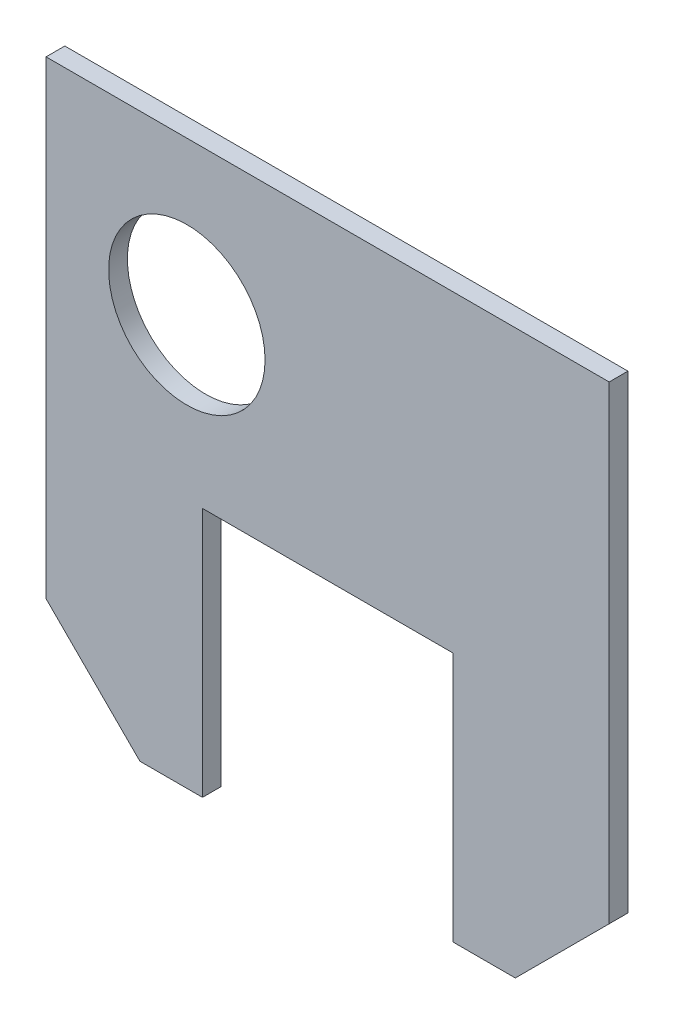
ISO-10303-21;
HEADER;
FILE_DESCRIPTION(('STEP AP214'),'2;1');
FILE_NAME('part.step','',(''),(''),'','','');
FILE_SCHEMA(('AUTOMOTIVE_DESIGN { 1 0 10303 214 1 1 1 1 }'));
ENDSEC;
DATA;
#1=APPLICATION_CONTEXT('core data for automotive mechanical design processes');
#2=APPLICATION_PROTOCOL_DEFINITION('international standard','automotive_design',2000,#1);
#3=PRODUCT_CONTEXT('',#1,'mechanical');
#4=PRODUCT('Part','Part','',(#3));
#5=PRODUCT_RELATED_PRODUCT_CATEGORY('part','',(#4));
#6=PRODUCT_DEFINITION_FORMATION('','',#4);
#7=PRODUCT_DEFINITION_CONTEXT('part definition',#1,'design');
#8=PRODUCT_DEFINITION('design','',#6,#7);
#9=PRODUCT_DEFINITION_SHAPE('','',#8);
#10=(LENGTH_UNIT() NAMED_UNIT(*) SI_UNIT(.MILLI.,.METRE.));
#11=(NAMED_UNIT(*) PLANE_ANGLE_UNIT() SI_UNIT($,.RADIAN.));
#12=(NAMED_UNIT(*) SI_UNIT($,.STERADIAN.) SOLID_ANGLE_UNIT());
#13=UNCERTAINTY_MEASURE_WITH_UNIT(LENGTH_MEASURE(1.E-05),#10,'distance_accuracy_value','');
#14=(GEOMETRIC_REPRESENTATION_CONTEXT(3) GLOBAL_UNCERTAINTY_ASSIGNED_CONTEXT((#13)) GLOBAL_UNIT_ASSIGNED_CONTEXT((#10,
#11,#12)) REPRESENTATION_CONTEXT('',''));
#15=CARTESIAN_POINT('',(0.,0.,0.));
#16=DIRECTION('',(0.,0.,1.));
#17=DIRECTION('',(1.,0.,0.));
#18=AXIS2_PLACEMENT_3D('',#15,#16,#17);
#19=CARTESIAN_POINT('',(-11.2795505617978,31.7797752808989,3.));
#20=DIRECTION('',(1.,0.,0.));
#21=DIRECTION('',(0.,1.,0.));
#22=AXIS2_PLACEMENT_3D('',#19,#20,#21);
#23=PLANE('',#22);
#24=DIRECTION('',(0.,-1.,0.));
#25=VECTOR('',#24,1.);
#26=CARTESIAN_POINT('',(-11.2795505617978,31.7797752808989,0.));
#27=LINE('',#26,#25);
#28=CARTESIAN_POINT('',(-11.2795505617978,31.7797752808989,0.));
#29=VERTEX_POINT('',#28);
#30=CARTESIAN_POINT('',(-11.2795505617978,-43.2202247191013,0.));
#31=VERTEX_POINT('',#30);
#32=EDGE_CURVE('E116',#29,#31,#27,.T.);
#33=ORIENTED_EDGE('',*,*,#32,.T.);
#34=DIRECTION('',(0.,0.,-1.));
#35=VECTOR('',#34,1.);
#36=CARTESIAN_POINT('',(-11.2795505617978,-43.2202247191013,3.));
#37=LINE('',#36,#35);
#38=CARTESIAN_POINT('',(-11.2795505617978,-43.2202247191013,3.));
#39=VERTEX_POINT('',#38);
#40=EDGE_CURVE('E11',#39,#31,#37,.T.);
#41=ORIENTED_EDGE('',*,*,#40,.F.);
#42=DIRECTION('',(0.,-1.,0.));
#43=VECTOR('',#42,1.);
#44=CARTESIAN_POINT('',(-11.2795505617978,31.7797752808989,3.));
#45=LINE('',#44,#43);
#46=CARTESIAN_POINT('',(-11.2795505617978,31.7797752808989,3.));
#47=VERTEX_POINT('',#46);
#48=EDGE_CURVE('E119',#47,#39,#45,.T.);
#49=ORIENTED_EDGE('',*,*,#48,.F.);
#50=DIRECTION('',(0.,0.,-1.));
#51=VECTOR('',#50,1.);
#52=CARTESIAN_POINT('',(-11.2795505617978,31.7797752808989,3.));
#53=LINE('',#52,#51);
#54=EDGE_CURVE('E181',#47,#29,#53,.T.);
#55=ORIENTED_EDGE('',*,*,#54,.T.);
#56=EDGE_LOOP('',(#33,#41,#49,#55));
#57=FACE_BOUND('',#56,.T.);
#58=ADVANCED_FACE('F32',(#57),#23,.F.);
#59=CARTESIAN_POINT('',(3.72044943820224,-58.2202247191011,3.));
#60=DIRECTION('',(0.707106781186543,0.707106781186552,0.));
#61=DIRECTION('',(-0.707106781186552,0.707106781186543,0.));
#62=AXIS2_PLACEMENT_3D('',#59,#60,#61);
#63=PLANE('',#62);
#64=DIRECTION('',(0.707106781186551,-0.707106781186543,0.));
#65=VECTOR('',#64,1.);
#66=CARTESIAN_POINT('',(3.72044943820224,-58.2202247191011,0.));
#67=LINE('',#66,#65);
#68=CARTESIAN_POINT('',(3.72044943820224,-58.2202247191011,0.));
#69=VERTEX_POINT('',#68);
#70=EDGE_CURVE('E165',#31,#69,#67,.T.);
#71=ORIENTED_EDGE('',*,*,#70,.T.);
#72=DIRECTION('',(0.,0.,-1.));
#73=VECTOR('',#72,1.);
#74=CARTESIAN_POINT('',(3.72044943820224,-58.2202247191011,3.));
#75=LINE('',#74,#73);
#76=CARTESIAN_POINT('',(3.72044943820224,-58.2202247191011,3.));
#77=VERTEX_POINT('',#76);
#78=EDGE_CURVE('E39',#77,#69,#75,.T.);
#79=ORIENTED_EDGE('',*,*,#78,.F.);
#80=DIRECTION('',(0.707106781186551,-0.707106781186543,0.));
#81=VECTOR('',#80,1.);
#82=CARTESIAN_POINT('',(3.72044943820224,-58.2202247191011,3.));
#83=LINE('',#82,#81);
#84=EDGE_CURVE('E173',#39,#77,#83,.T.);
#85=ORIENTED_EDGE('',*,*,#84,.F.);
#86=ORIENTED_EDGE('',*,*,#40,.T.);
#87=EDGE_LOOP('',(#71,#79,#85,#86));
#88=FACE_BOUND('',#87,.T.);
#89=ADVANCED_FACE('F225',(#88),#63,.F.);
#90=CARTESIAN_POINT('',(3.72044943820224,-58.2202247191011,3.));
#91=DIRECTION('',(0.,1.,0.));
#92=DIRECTION('',(0.,0.,1.));
#93=AXIS2_PLACEMENT_3D('',#90,#91,#92);
#94=PLANE('',#93);
#95=DIRECTION('',(1.,0.,0.));
#96=VECTOR('',#95,1.);
#97=CARTESIAN_POINT('',(3.72044943820224,-58.2202247191011,0.));
#98=LINE('',#97,#96);
#99=CARTESIAN_POINT('',(13.7204494382022,-58.2202247191011,0.));
#100=VERTEX_POINT('',#99);
#101=EDGE_CURVE('E167',#69,#100,#98,.T.);
#102=ORIENTED_EDGE('',*,*,#101,.T.);
#103=DIRECTION('',(0.,0.,-1.));
#104=VECTOR('',#103,1.);
#105=CARTESIAN_POINT('',(13.7204494382022,-58.2202247191011,3.));
#106=LINE('',#105,#104);
#107=CARTESIAN_POINT('',(13.7204494382022,-58.2202247191011,3.));
#108=VERTEX_POINT('',#107);
#109=EDGE_CURVE('E186',#108,#100,#106,.T.);
#110=ORIENTED_EDGE('',*,*,#109,.F.);
#111=DIRECTION('',(1.,0.,0.));
#112=VECTOR('',#111,1.);
#113=CARTESIAN_POINT('',(3.72044943820224,-58.2202247191011,3.));
#114=LINE('',#113,#112);
#115=EDGE_CURVE('E175',#77,#108,#114,.T.);
#116=ORIENTED_EDGE('',*,*,#115,.F.);
#117=ORIENTED_EDGE('',*,*,#78,.T.);
#118=EDGE_LOOP('',(#102,#110,#116,#117));
#119=FACE_BOUND('',#118,.T.);
#120=ADVANCED_FACE('F193',(#119),#94,.F.);
#121=CARTESIAN_POINT('',(13.7204494382022,-58.2202247191011,3.));
#122=DIRECTION('',(-1.,0.,0.));
#123=DIRECTION('',(0.,0.,1.));
#124=AXIS2_PLACEMENT_3D('',#121,#122,#123);
#125=PLANE('',#124);
#126=DIRECTION('',(0.,1.,0.));
#127=VECTOR('',#126,1.);
#128=CARTESIAN_POINT('',(13.7204494382022,-58.2202247191011,0.));
#129=LINE('',#128,#127);
#130=CARTESIAN_POINT('',(13.7204494382022,-18.2202247191011,0.));
#131=VERTEX_POINT('',#130);
#132=EDGE_CURVE('E169',#100,#131,#129,.T.);
#133=ORIENTED_EDGE('',*,*,#132,.T.);
#134=DIRECTION('',(0.,0.,-1.));
#135=VECTOR('',#134,1.);
#136=CARTESIAN_POINT('',(13.7204494382022,-18.2202247191011,3.));
#137=LINE('',#136,#135);
#138=CARTESIAN_POINT('',(13.7204494382022,-18.2202247191011,3.));
#139=VERTEX_POINT('',#138);
#140=EDGE_CURVE('E183',#139,#131,#137,.T.);
#141=ORIENTED_EDGE('',*,*,#140,.F.);
#142=DIRECTION('',(0.,1.,0.));
#143=VECTOR('',#142,1.);
#144=CARTESIAN_POINT('',(13.7204494382022,-58.2202247191011,3.));
#145=LINE('',#144,#143);
#146=EDGE_CURVE('E53',#108,#139,#145,.T.);
#147=ORIENTED_EDGE('',*,*,#146,.F.);
#148=ORIENTED_EDGE('',*,*,#109,.T.);
#149=EDGE_LOOP('',(#133,#141,#147,#148));
#150=FACE_BOUND('',#149,.T.);
#151=ADVANCED_FACE('F199',(#150),#125,.F.);
#152=CARTESIAN_POINT('',(13.7204494382022,-18.2202247191011,3.));
#153=DIRECTION('',(0.,1.,0.));
#154=DIRECTION('',(-1.,0.,0.));
#155=AXIS2_PLACEMENT_3D('',#152,#153,#154);
#156=PLANE('',#155);
#157=DIRECTION('',(1.,0.,0.));
#158=VECTOR('',#157,1.);
#159=CARTESIAN_POINT('',(13.7204494382022,-18.2202247191011,0.));
#160=LINE('',#159,#158);
#161=CARTESIAN_POINT('',(53.7204494382022,-18.2202247191011,0.));
#162=VERTEX_POINT('',#161);
#163=EDGE_CURVE('E120',#131,#162,#160,.T.);
#164=ORIENTED_EDGE('',*,*,#163,.T.);
#165=DIRECTION('',(0.,0.,-1.));
#166=VECTOR('',#165,1.);
#167=CARTESIAN_POINT('',(53.7204494382022,-18.2202247191011,3.));
#168=LINE('',#167,#166);
#169=CARTESIAN_POINT('',(53.7204494382022,-18.2202247191011,3.));
#170=VERTEX_POINT('',#169);
#171=EDGE_CURVE('E127',#170,#162,#168,.T.);
#172=ORIENTED_EDGE('',*,*,#171,.F.);
#173=DIRECTION('',(1.,0.,0.));
#174=VECTOR('',#173,1.);
#175=CARTESIAN_POINT('',(13.7204494382022,-18.2202247191011,3.));
#176=LINE('',#175,#174);
#177=EDGE_CURVE('E178',#139,#170,#176,.T.);
#178=ORIENTED_EDGE('',*,*,#177,.F.);
#179=ORIENTED_EDGE('',*,*,#140,.T.);
#180=EDGE_LOOP('',(#164,#172,#178,#179));
#181=FACE_BOUND('',#180,.T.);
#182=ADVANCED_FACE('F202',(#181),#156,.F.);
#183=CARTESIAN_POINT('',(-11.2795505617978,31.7797752808989,3.));
#184=DIRECTION('',(0.,-1.,0.));
#185=DIRECTION('',(0.,0.,-1.));
#186=AXIS2_PLACEMENT_3D('',#183,#184,#185);
#187=PLANE('',#186);
#188=DIRECTION('',(-1.,0.,0.));
#189=VECTOR('',#188,1.);
#190=CARTESIAN_POINT('',(-11.2795505617978,31.7797752808989,0.));
#191=LINE('',#190,#189);
#192=CARTESIAN_POINT('',(78.7204494382022,31.7797752808988,0.));
#193=VERTEX_POINT('',#192);
#194=EDGE_CURVE('E108',#193,#29,#191,.T.);
#195=ORIENTED_EDGE('',*,*,#194,.T.);
#196=ORIENTED_EDGE('',*,*,#54,.F.);
#197=DIRECTION('',(-1.,0.,0.));
#198=VECTOR('',#197,1.);
#199=CARTESIAN_POINT('',(-11.2795505617978,31.7797752808989,3.));
#200=LINE('',#199,#198);
#201=CARTESIAN_POINT('',(78.7204494382022,31.7797752808988,3.));
#202=VERTEX_POINT('',#201);
#203=EDGE_CURVE('E46',#202,#47,#200,.T.);
#204=ORIENTED_EDGE('',*,*,#203,.F.);
#205=DIRECTION('',(0.,0.,-1.));
#206=VECTOR('',#205,1.);
#207=CARTESIAN_POINT('',(78.7204494382022,31.7797752808988,3.));
#208=LINE('',#207,#206);
#209=EDGE_CURVE('E123',#202,#193,#208,.T.);
#210=ORIENTED_EDGE('',*,*,#209,.T.);
#211=EDGE_LOOP('',(#195,#196,#204,#210));
#212=FACE_BOUND('',#211,.T.);
#213=ADVANCED_FACE('F124',(#212),#187,.F.);
#214=CARTESIAN_POINT('',(-11.2795505617978,31.7797752808989,3.));
#215=DIRECTION('',(0.,0.,1.));
#216=DIRECTION('',(1.,0.,0.));
#217=AXIS2_PLACEMENT_3D('',#214,#215,#216);
#218=PLANE('',#217);
#219=CARTESIAN_POINT('',(11.2204494382022,7.32524706460091,3.));
#220=DIRECTION('',(0.,0.,1.));
#221=DIRECTION('',(1.,0.,0.));
#222=AXIS2_PLACEMENT_3D('',#219,#220,#221);
#223=CIRCLE('',#222,12.5);
#224=CARTESIAN_POINT('',(23.7204494382022,7.32524706460091,3.));
#225=VERTEX_POINT('',#224);
#226=EDGE_CURVE('E138',#225,#225,#223,.T.);
#227=ORIENTED_EDGE('',*,*,#226,.F.);
#228=EDGE_LOOP('',(#227));
#229=FACE_BOUND('',#228,.T.);
#230=ORIENTED_EDGE('',*,*,#48,.T.);
#231=ORIENTED_EDGE('',*,*,#84,.T.);
#232=ORIENTED_EDGE('',*,*,#115,.T.);
#233=ORIENTED_EDGE('',*,*,#146,.T.);
#234=ORIENTED_EDGE('',*,*,#177,.T.);
#235=DIRECTION('',(0.,1.,0.));
#236=VECTOR('',#235,1.);
#237=CARTESIAN_POINT('',(53.7204494382022,-58.2202247191011,3.));
#238=LINE('',#237,#236);
#239=CARTESIAN_POINT('',(53.7204494382022,-58.2202247191011,3.));
#240=VERTEX_POINT('',#239);
#241=EDGE_CURVE('E148',#240,#170,#238,.T.);
#242=ORIENTED_EDGE('',*,*,#241,.F.);
#243=DIRECTION('',(-1.,0.,0.));
#244=VECTOR('',#243,1.);
#245=CARTESIAN_POINT('',(63.7204494382022,-58.2202247191011,3.));
#246=LINE('',#245,#244);
#247=CARTESIAN_POINT('',(63.7204494382022,-58.2202247191011,3.));
#248=VERTEX_POINT('',#247);
#249=EDGE_CURVE('E151',#248,#240,#246,.T.);
#250=ORIENTED_EDGE('',*,*,#249,.F.);
#251=DIRECTION('',(-0.707106781186552,-0.707106781186543,0.));
#252=VECTOR('',#251,1.);
#253=CARTESIAN_POINT('',(63.7204494382022,-58.2202247191011,3.));
#254=LINE('',#253,#252);
#255=CARTESIAN_POINT('',(78.7204494382022,-43.2202247191013,3.));
#256=VERTEX_POINT('',#255);
#257=EDGE_CURVE('E154',#256,#248,#254,.T.);
#258=ORIENTED_EDGE('',*,*,#257,.F.);
#259=DIRECTION('',(0.,-1.,0.));
#260=VECTOR('',#259,1.);
#261=CARTESIAN_POINT('',(78.7204494382022,31.7797752808988,3.));
#262=LINE('',#261,#260);
#263=EDGE_CURVE('E146',#202,#256,#262,.T.);
#264=ORIENTED_EDGE('',*,*,#263,.F.);
#265=ORIENTED_EDGE('',*,*,#203,.T.);
#266=EDGE_LOOP('',(#230,#231,#232,#233,#234,#242,#250,#258,#264,#265));
#267=FACE_BOUND('',#266,.T.);
#268=ADVANCED_FACE('F205',(#229,#267),#218,.T.);
#269=CARTESIAN_POINT('',(-11.2795505617978,31.7797752808989,0.));
#270=DIRECTION('',(0.,0.,1.));
#271=DIRECTION('',(1.,0.,0.));
#272=AXIS2_PLACEMENT_3D('',#269,#270,#271);
#273=PLANE('',#272);
#274=CARTESIAN_POINT('',(11.2204494382022,7.32524706460091,0.));
#275=DIRECTION('',(0.,0.,1.));
#276=DIRECTION('',(1.,0.,0.));
#277=AXIS2_PLACEMENT_3D('',#274,#275,#276);
#278=CIRCLE('',#277,12.5);
#279=CARTESIAN_POINT('',(23.7204494382022,7.32524706460091,0.));
#280=VERTEX_POINT('',#279);
#281=EDGE_CURVE('E132',#280,#280,#278,.T.);
#282=ORIENTED_EDGE('',*,*,#281,.T.);
#283=EDGE_LOOP('',(#282));
#284=FACE_BOUND('',#283,.T.);
#285=ORIENTED_EDGE('',*,*,#32,.F.);
#286=ORIENTED_EDGE('',*,*,#194,.F.);
#287=DIRECTION('',(0.,-1.,0.));
#288=VECTOR('',#287,1.);
#289=CARTESIAN_POINT('',(78.7204494382022,31.7797752808988,0.));
#290=LINE('',#289,#288);
#291=CARTESIAN_POINT('',(78.7204494382022,-43.2202247191013,0.));
#292=VERTEX_POINT('',#291);
#293=EDGE_CURVE('E113',#193,#292,#290,.T.);
#294=ORIENTED_EDGE('',*,*,#293,.T.);
#295=DIRECTION('',(-0.707106781186552,-0.707106781186543,0.));
#296=VECTOR('',#295,1.);
#297=CARTESIAN_POINT('',(63.7204494382022,-58.2202247191011,0.));
#298=LINE('',#297,#296);
#299=CARTESIAN_POINT('',(63.7204494382022,-58.2202247191011,0.));
#300=VERTEX_POINT('',#299);
#301=EDGE_CURVE('E144',#292,#300,#298,.T.);
#302=ORIENTED_EDGE('',*,*,#301,.T.);
#303=DIRECTION('',(-1.,0.,0.));
#304=VECTOR('',#303,1.);
#305=CARTESIAN_POINT('',(63.7204494382022,-58.2202247191011,0.));
#306=LINE('',#305,#304);
#307=CARTESIAN_POINT('',(53.7204494382022,-58.2202247191011,0.));
#308=VERTEX_POINT('',#307);
#309=EDGE_CURVE('E135',#300,#308,#306,.T.);
#310=ORIENTED_EDGE('',*,*,#309,.T.);
#311=DIRECTION('',(0.,1.,0.));
#312=VECTOR('',#311,1.);
#313=CARTESIAN_POINT('',(53.7204494382022,-58.2202247191011,0.));
#314=LINE('',#313,#312);
#315=EDGE_CURVE('E131',#308,#162,#314,.T.);
#316=ORIENTED_EDGE('',*,*,#315,.T.);
#317=ORIENTED_EDGE('',*,*,#163,.F.);
#318=ORIENTED_EDGE('',*,*,#132,.F.);
#319=ORIENTED_EDGE('',*,*,#101,.F.);
#320=ORIENTED_EDGE('',*,*,#70,.F.);
#321=EDGE_LOOP('',(#285,#286,#294,#302,#310,#316,#317,#318,#319,#320));
#322=FACE_BOUND('',#321,.T.);
#323=ADVANCED_FACE('F110',(#284,#322),#273,.F.);
#324=CARTESIAN_POINT('',(78.7204494382022,31.7797752808988,3.));
#325=DIRECTION('',(1.,0.,0.));
#326=DIRECTION('',(0.,1.,0.));
#327=AXIS2_PLACEMENT_3D('',#324,#325,#326);
#328=PLANE('',#327);
#329=ORIENTED_EDGE('',*,*,#293,.F.);
#330=ORIENTED_EDGE('',*,*,#209,.F.);
#331=ORIENTED_EDGE('',*,*,#263,.T.);
#332=DIRECTION('',(0.,0.,-1.));
#333=VECTOR('',#332,1.);
#334=CARTESIAN_POINT('',(78.7204494382022,-43.2202247191013,3.));
#335=LINE('',#334,#333);
#336=EDGE_CURVE('E130',#256,#292,#335,.T.);
#337=ORIENTED_EDGE('',*,*,#336,.T.);
#338=EDGE_LOOP('',(#329,#330,#331,#337));
#339=FACE_BOUND('',#338,.T.);
#340=ADVANCED_FACE('F129',(#339),#328,.T.);
#341=CARTESIAN_POINT('',(53.7204494382022,-58.2202247191011,3.));
#342=DIRECTION('',(-1.,0.,0.));
#343=DIRECTION('',(0.,-1.,0.));
#344=AXIS2_PLACEMENT_3D('',#341,#342,#343);
#345=PLANE('',#344);
#346=ORIENTED_EDGE('',*,*,#315,.F.);
#347=DIRECTION('',(0.,0.,-1.));
#348=VECTOR('',#347,1.);
#349=CARTESIAN_POINT('',(53.7204494382022,-58.2202247191011,3.));
#350=LINE('',#349,#348);
#351=EDGE_CURVE('E160',#240,#308,#350,.T.);
#352=ORIENTED_EDGE('',*,*,#351,.F.);
#353=ORIENTED_EDGE('',*,*,#241,.T.);
#354=ORIENTED_EDGE('',*,*,#171,.T.);
#355=EDGE_LOOP('',(#346,#352,#353,#354));
#356=FACE_BOUND('',#355,.T.);
#357=ADVANCED_FACE('F215',(#356),#345,.T.);
#358=CARTESIAN_POINT('',(63.7204494382022,-58.2202247191011,3.));
#359=DIRECTION('',(0.,-1.,0.));
#360=DIRECTION('',(1.,0.,0.));
#361=AXIS2_PLACEMENT_3D('',#358,#359,#360);
#362=PLANE('',#361);
#363=ORIENTED_EDGE('',*,*,#309,.F.);
#364=DIRECTION('',(0.,0.,-1.));
#365=VECTOR('',#364,1.);
#366=CARTESIAN_POINT('',(63.7204494382022,-58.2202247191011,3.));
#367=LINE('',#366,#365);
#368=EDGE_CURVE('E158',#248,#300,#367,.T.);
#369=ORIENTED_EDGE('',*,*,#368,.F.);
#370=ORIENTED_EDGE('',*,*,#249,.T.);
#371=ORIENTED_EDGE('',*,*,#351,.T.);
#372=EDGE_LOOP('',(#363,#369,#370,#371));
#373=FACE_BOUND('',#372,.T.);
#374=ADVANCED_FACE('F211',(#373),#362,.T.);
#375=CARTESIAN_POINT('',(63.7204494382022,-58.2202247191011,3.));
#376=DIRECTION('',(0.707106781186543,-0.707106781186552,0.));
#377=DIRECTION('',(0.707106781186552,0.707106781186543,0.));
#378=AXIS2_PLACEMENT_3D('',#375,#376,#377);
#379=PLANE('',#378);
#380=ORIENTED_EDGE('',*,*,#301,.F.);
#381=ORIENTED_EDGE('',*,*,#336,.F.);
#382=ORIENTED_EDGE('',*,*,#257,.T.);
#383=ORIENTED_EDGE('',*,*,#368,.T.);
#384=EDGE_LOOP('',(#380,#381,#382,#383));
#385=FACE_BOUND('',#384,.T.);
#386=ADVANCED_FACE('F214',(#385),#379,.T.);
#387=CARTESIAN_POINT('',(11.2204494382022,7.32524706460091,0.));
#388=DIRECTION('',(0.,0.,1.));
#389=DIRECTION('',(1.,0.,0.));
#390=AXIS2_PLACEMENT_3D('',#387,#388,#389);
#391=CYLINDRICAL_SURFACE('',#390,12.5);
#392=ORIENTED_EDGE('',*,*,#281,.F.);
#393=EDGE_LOOP('',(#392));
#394=FACE_BOUND('',#393,.T.);
#395=ORIENTED_EDGE('',*,*,#226,.T.);
#396=EDGE_LOOP('',(#395));
#397=FACE_BOUND('',#396,.T.);
#398=ADVANCED_FACE('F252',(#394,#397),#391,.F.);
#399=CLOSED_SHELL('',(#58,#89,#120,#151,#182,#213,#268,#323,#340,#357,#374,#386,#398));
#400=MANIFOLD_SOLID_BREP('B2',#399);
#401=ADVANCED_BREP_SHAPE_REPRESENTATION('',(#18,#400),#14);
#402=SHAPE_DEFINITION_REPRESENTATION(#9,#401);
ENDSEC;
END-ISO-10303-21;
